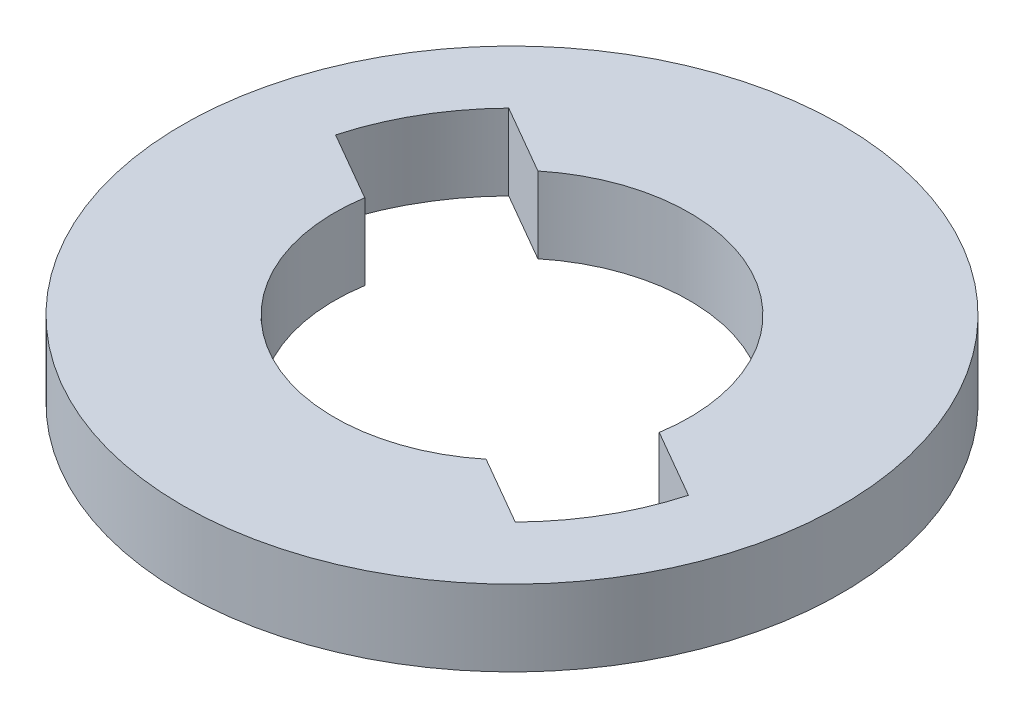
ISO-10303-21;
HEADER;
FILE_DESCRIPTION(('STEP AP214'),'2;1');
FILE_NAME('part.step','',(''),(''),'','','');
FILE_SCHEMA(('AUTOMOTIVE_DESIGN { 1 0 10303 214 1 1 1 1 }'));
ENDSEC;
DATA;
#1=APPLICATION_CONTEXT('core data for automotive mechanical design processes');
#2=APPLICATION_PROTOCOL_DEFINITION('international standard','automotive_design',2000,#1);
#3=PRODUCT_CONTEXT('',#1,'mechanical');
#4=PRODUCT('Part','Part','',(#3));
#5=PRODUCT_RELATED_PRODUCT_CATEGORY('part','',(#4));
#6=PRODUCT_DEFINITION_FORMATION('','',#4);
#7=PRODUCT_DEFINITION_CONTEXT('part definition',#1,'design');
#8=PRODUCT_DEFINITION('design','',#6,#7);
#9=PRODUCT_DEFINITION_SHAPE('','',#8);
#10=(LENGTH_UNIT() NAMED_UNIT(*) SI_UNIT(.MILLI.,.METRE.));
#11=(NAMED_UNIT(*) PLANE_ANGLE_UNIT() SI_UNIT($,.RADIAN.));
#12=(NAMED_UNIT(*) SI_UNIT($,.STERADIAN.) SOLID_ANGLE_UNIT());
#13=UNCERTAINTY_MEASURE_WITH_UNIT(LENGTH_MEASURE(1.E-05),#10,'distance_accuracy_value','');
#14=(GEOMETRIC_REPRESENTATION_CONTEXT(3) GLOBAL_UNCERTAINTY_ASSIGNED_CONTEXT((#13)) GLOBAL_UNIT_ASSIGNED_CONTEXT((#10,
#11,#12)) REPRESENTATION_CONTEXT('',''));
#15=CARTESIAN_POINT('',(0.,0.,0.));
#16=DIRECTION('',(0.,0.,1.));
#17=DIRECTION('',(1.,0.,0.));
#18=AXIS2_PLACEMENT_3D('',#15,#16,#17);
#19=CARTESIAN_POINT('',(-13.01,-9.,-50.0940107675848));
#20=DIRECTION('',(0.,-1.,0.));
#21=DIRECTION('',(0.,0.,-1.));
#22=AXIS2_PLACEMENT_3D('',#19,#20,#21);
#23=PLANE('',#22);
#24=CARTESIAN_POINT('',(0.,-9.,-63.0940107675848));
#25=DIRECTION('',(0.,-1.,0.));
#26=DIRECTION('',(0.,0.,-1.));
#27=AXIS2_PLACEMENT_3D('',#24,#25,#26);
#28=CIRCLE('',#27,13.);
#29=CARTESIAN_POINT('',(0.,-9.,-76.0940107675848));
#30=VERTEX_POINT('',#29);
#31=EDGE_CURVE('E47',#30,#30,#28,.F.);
#32=ORIENTED_EDGE('',*,*,#31,.T.);
#33=EDGE_LOOP('',(#32));
#34=FACE_BOUND('',#33,.T.);
#35=CARTESIAN_POINT('',(0.,-9.,-63.0940107675848));
#36=DIRECTION('',(0.,-1.,0.));
#37=DIRECTION('',(0.,0.,-1.));
#38=AXIS2_PLACEMENT_3D('',#35,#36,#37);
#39=CIRCLE('',#38,10.);
#40=CARTESIAN_POINT('',(-9.63525491562415,-9.,-65.770176440883));
#41=VERTEX_POINT('',#40);
#42=CARTESIAN_POINT('',(-7.13525491562421,-9.,-70.1003034598052));
#43=VERTEX_POINT('',#42);
#44=EDGE_CURVE('E108',#41,#43,#39,.T.);
#45=ORIENTED_EDGE('',*,*,#44,.T.);
#46=DIRECTION('',(-0.866025403784449,0.,-0.499999999999982));
#47=VECTOR('',#46,1.);
#48=CARTESIAN_POINT('',(1.25000000000002,-9.,-65.2590742770462));
#49=LINE('',#48,#47);
#50=CARTESIAN_POINT('',(-4.41237582645304,-9.,-68.5282484847015));
#51=VERTEX_POINT('',#50);
#52=EDGE_CURVE('E128',#51,#43,#49,.T.);
#53=ORIENTED_EDGE('',*,*,#52,.F.);
#54=CARTESIAN_POINT('',(0.,-9.,-63.0940107675848));
#55=DIRECTION('',(0.,-1.,0.));
#56=DIRECTION('',(0.,0.,-1.));
#57=AXIS2_PLACEMENT_3D('',#54,#55,#56);
#58=CIRCLE('',#57,7.);
#59=CARTESIAN_POINT('',(6.91237582645303,-9.,-61.9899000693905));
#60=VERTEX_POINT('',#59);
#61=EDGE_CURVE('E127',#51,#60,#58,.T.);
#62=ORIENTED_EDGE('',*,*,#61,.T.);
#63=DIRECTION('',(0.866025403784443,0.,0.499999999999993));
#64=VECTOR('',#63,1.);
#65=CARTESIAN_POINT('',(1.24999999999994,-9.,-65.2590742770459));
#66=LINE('',#65,#64);
#67=CARTESIAN_POINT('',(9.63525491562419,-9.,-60.4178450942867));
#68=VERTEX_POINT('',#67);
#69=EDGE_CURVE('E153',#60,#68,#66,.T.);
#70=ORIENTED_EDGE('',*,*,#69,.T.);
#71=CARTESIAN_POINT('',(7.13525491562422,-9.,-56.0877180753645));
#72=VERTEX_POINT('',#71);
#73=EDGE_CURVE('E119',#68,#72,#39,.T.);
#74=ORIENTED_EDGE('',*,*,#73,.T.);
#75=DIRECTION('',(0.866025403784443,0.,0.499999999999992));
#76=VECTOR('',#75,1.);
#77=CARTESIAN_POINT('',(-1.25000000000003,-9.,-60.9289472581237));
#78=LINE('',#77,#76);
#79=CARTESIAN_POINT('',(4.41237582645306,-9.,-57.6597730504683));
#80=VERTEX_POINT('',#79);
#81=EDGE_CURVE('E135',#80,#72,#78,.T.);
#82=ORIENTED_EDGE('',*,*,#81,.F.);
#83=CARTESIAN_POINT('',(-6.91237582645309,-9.,-64.1981214657793));
#84=VERTEX_POINT('',#83);
#85=EDGE_CURVE('E124',#80,#84,#58,.T.);
#86=ORIENTED_EDGE('',*,*,#85,.T.);
#87=DIRECTION('',(-0.866025403784447,0.,-0.499999999999986));
#88=VECTOR('',#87,1.);
#89=CARTESIAN_POINT('',(-1.24999999999991,-9.,-60.9289472581239));
#90=LINE('',#89,#88);
#91=EDGE_CURVE('E121',#84,#41,#90,.T.);
#92=ORIENTED_EDGE('',*,*,#91,.T.);
#93=EDGE_LOOP('',(#45,#53,#62,#70,#74,#82,#86,#92));
#94=FACE_BOUND('',#93,.T.);
#95=ADVANCED_FACE('F43',(#34,#94),#23,.F.);
#96=CARTESIAN_POINT('',(0.,-12.,-63.0940107675848));
#97=DIRECTION('',(0.,1.,0.));
#98=DIRECTION('',(0.,0.,1.));
#99=AXIS2_PLACEMENT_3D('',#96,#97,#98);
#100=CYLINDRICAL_SURFACE('',#99,7.);
#101=ORIENTED_EDGE('',*,*,#61,.F.);
#102=DIRECTION('',(0.,1.,0.));
#103=VECTOR('',#102,1.);
#104=CARTESIAN_POINT('',(-4.41237582645303,-12.,-68.5282484847015));
#105=LINE('',#104,#103);
#106=CARTESIAN_POINT('',(-4.41237582645303,-12.,-68.5282484847015));
#107=VERTEX_POINT('',#106);
#108=EDGE_CURVE('E52',#51,#107,#105,.F.);
#109=ORIENTED_EDGE('',*,*,#108,.T.);
#110=CARTESIAN_POINT('',(0.,-12.,-63.0940107675848));
#111=DIRECTION('',(0.,-1.,0.));
#112=DIRECTION('',(0.,0.,-1.));
#113=AXIS2_PLACEMENT_3D('',#110,#111,#112);
#114=CIRCLE('',#113,7.);
#115=CARTESIAN_POINT('',(6.91237582645303,-12.,-61.9899000693905));
#116=VERTEX_POINT('',#115);
#117=EDGE_CURVE('E157',#107,#116,#114,.T.);
#118=ORIENTED_EDGE('',*,*,#117,.T.);
#119=DIRECTION('',(0.,1.,0.));
#120=VECTOR('',#119,1.);
#121=CARTESIAN_POINT('',(6.91237582645303,-12.,-61.9899000693905));
#122=LINE('',#121,#120);
#123=EDGE_CURVE('E168',#60,#116,#122,.F.);
#124=ORIENTED_EDGE('',*,*,#123,.F.);
#125=EDGE_LOOP('',(#101,#109,#118,#124));
#126=FACE_BOUND('',#125,.T.);
#127=ADVANCED_FACE('F173',(#126),#100,.F.);
#128=CARTESIAN_POINT('',(28.5705080756884,1.88125740416496,-49.4855715851502));
#129=DIRECTION('',(0.499999999999993,0.,-0.866025403784443));
#130=DIRECTION('',(-0.866025403784443,0.,-0.499999999999993));
#131=AXIS2_PLACEMENT_3D('',#128,#129,#130);
#132=PLANE('',#131);
#133=ORIENTED_EDGE('',*,*,#123,.T.);
#134=DIRECTION('',(0.866025403784443,0.,0.499999999999993));
#135=VECTOR('',#134,1.);
#136=CARTESIAN_POINT('',(28.5705080756884,-12.,-49.4855715851502));
#137=LINE('',#136,#135);
#138=CARTESIAN_POINT('',(9.63525491562419,-12.,-60.4178450942867));
#139=VERTEX_POINT('',#138);
#140=EDGE_CURVE('E140',#116,#139,#137,.T.);
#141=ORIENTED_EDGE('',*,*,#140,.T.);
#142=DIRECTION('',(0.,-1.,0.));
#143=VECTOR('',#142,1.);
#144=CARTESIAN_POINT('',(9.63525491562419,1.88125740416496,-60.4178450942867));
#145=LINE('',#144,#143);
#146=EDGE_CURVE('E147',#68,#139,#145,.T.);
#147=ORIENTED_EDGE('',*,*,#146,.F.);
#148=ORIENTED_EDGE('',*,*,#69,.F.);
#149=EDGE_LOOP('',(#133,#141,#147,#148));
#150=FACE_BOUND('',#149,.T.);
#151=ADVANCED_FACE('F182',(#150),#132,.F.);
#152=CARTESIAN_POINT('',(28.5705080756881,1.88125740416496,-49.485571585151));
#153=DIRECTION('',(-0.499999999999982,0.,0.866025403784449));
#154=DIRECTION('',(0.866025403784449,0.,0.499999999999982));
#155=AXIS2_PLACEMENT_3D('',#152,#153,#154);
#156=PLANE('',#155);
#157=ORIENTED_EDGE('',*,*,#52,.T.);
#158=DIRECTION('',(0.,-1.,0.));
#159=VECTOR('',#158,1.);
#160=CARTESIAN_POINT('',(-7.13525491562421,1.88125740416496,-70.1003034598052));
#161=LINE('',#160,#159);
#162=CARTESIAN_POINT('',(-7.13525491562421,-12.,-70.1003034598052));
#163=VERTEX_POINT('',#162);
#164=EDGE_CURVE('E115',#43,#163,#161,.T.);
#165=ORIENTED_EDGE('',*,*,#164,.T.);
#166=DIRECTION('',(-0.866025403784449,0.,-0.499999999999982));
#167=VECTOR('',#166,1.);
#168=CARTESIAN_POINT('',(28.5705080756881,-12.,-49.485571585151));
#169=LINE('',#168,#167);
#170=EDGE_CURVE('E60',#107,#163,#169,.T.);
#171=ORIENTED_EDGE('',*,*,#170,.F.);
#172=ORIENTED_EDGE('',*,*,#108,.F.);
#173=EDGE_LOOP('',(#157,#165,#171,#172));
#174=FACE_BOUND('',#173,.T.);
#175=ADVANCED_FACE('F183',(#174),#156,.T.);
#176=CARTESIAN_POINT('',(0.,-9.,-63.0940107675848));
#177=DIRECTION('',(0.,1.,0.));
#178=DIRECTION('',(0.,0.,1.));
#179=AXIS2_PLACEMENT_3D('',#176,#177,#178);
#180=CYLINDRICAL_SURFACE('',#179,10.);
#181=ORIENTED_EDGE('',*,*,#73,.F.);
#182=ORIENTED_EDGE('',*,*,#146,.T.);
#183=CARTESIAN_POINT('',(0.,-12.,-63.0940107675848));
#184=DIRECTION('',(0.,-1.,0.));
#185=DIRECTION('',(0.,0.,-1.));
#186=AXIS2_PLACEMENT_3D('',#183,#184,#185);
#187=CIRCLE('',#186,10.);
#188=CARTESIAN_POINT('',(7.13525491562422,-12.,-56.0877180753645));
#189=VERTEX_POINT('',#188);
#190=EDGE_CURVE('E143',#139,#189,#187,.T.);
#191=ORIENTED_EDGE('',*,*,#190,.T.);
#192=DIRECTION('',(0.,-1.,0.));
#193=VECTOR('',#192,1.);
#194=CARTESIAN_POINT('',(7.13525491562422,1.88125740416496,-56.0877180753645));
#195=LINE('',#194,#193);
#196=EDGE_CURVE('E148',#72,#189,#195,.T.);
#197=ORIENTED_EDGE('',*,*,#196,.F.);
#198=EDGE_LOOP('',(#181,#182,#191,#197));
#199=FACE_BOUND('',#198,.T.);
#200=ADVANCED_FACE('F193',(#199),#180,.F.);
#201=CARTESIAN_POINT('',(26.0705080756884,1.88125740416496,-45.155444566228));
#202=DIRECTION('',(0.499999999999992,0.,-0.866025403784443));
#203=DIRECTION('',(-0.866025403784443,0.,-0.499999999999992));
#204=AXIS2_PLACEMENT_3D('',#201,#202,#203);
#205=PLANE('',#204);
#206=ORIENTED_EDGE('',*,*,#81,.T.);
#207=ORIENTED_EDGE('',*,*,#196,.T.);
#208=DIRECTION('',(0.866025403784443,0.,0.499999999999993));
#209=VECTOR('',#208,1.);
#210=CARTESIAN_POINT('',(26.0705080756884,-12.,-45.155444566228));
#211=LINE('',#210,#209);
#212=CARTESIAN_POINT('',(4.41237582645306,-12.,-57.6597730504683));
#213=VERTEX_POINT('',#212);
#214=EDGE_CURVE('E68',#213,#189,#211,.T.);
#215=ORIENTED_EDGE('',*,*,#214,.F.);
#216=DIRECTION('',(0.,1.,0.));
#217=VECTOR('',#216,1.);
#218=CARTESIAN_POINT('',(4.41237582645306,-12.,-57.6597730504683));
#219=LINE('',#218,#217);
#220=EDGE_CURVE('E166',#80,#213,#219,.F.);
#221=ORIENTED_EDGE('',*,*,#220,.F.);
#222=EDGE_LOOP('',(#206,#207,#215,#221));
#223=FACE_BOUND('',#222,.T.);
#224=ADVANCED_FACE('F190',(#223),#205,.T.);
#225=ORIENTED_EDGE('',*,*,#44,.F.);
#226=DIRECTION('',(0.,-1.,0.));
#227=VECTOR('',#226,1.);
#228=CARTESIAN_POINT('',(-9.63525491562415,1.88125740416496,-65.770176440883));
#229=LINE('',#228,#227);
#230=CARTESIAN_POINT('',(-9.63525491562415,-12.,-65.770176440883));
#231=VERTEX_POINT('',#230);
#232=EDGE_CURVE('E113',#41,#231,#229,.T.);
#233=ORIENTED_EDGE('',*,*,#232,.T.);
#234=CARTESIAN_POINT('',(0.,-12.,-63.0940107675848));
#235=DIRECTION('',(0.,-1.,0.));
#236=DIRECTION('',(0.,0.,-1.));
#237=AXIS2_PLACEMENT_3D('',#234,#235,#236);
#238=CIRCLE('',#237,9.99999999999993);
#239=EDGE_CURVE('E137',#231,#163,#238,.T.);
#240=ORIENTED_EDGE('',*,*,#239,.T.);
#241=ORIENTED_EDGE('',*,*,#164,.F.);
#242=EDGE_LOOP('',(#225,#233,#240,#241));
#243=FACE_BOUND('',#242,.T.);
#244=ADVANCED_FACE('F110',(#243),#180,.F.);
#245=CARTESIAN_POINT('',(0.,-12.,-63.0940107675848));
#246=DIRECTION('',(0.,-1.,0.));
#247=DIRECTION('',(0.,0.,-1.));
#248=AXIS2_PLACEMENT_3D('',#245,#246,#247);
#249=PLANE('',#248);
#250=DIRECTION('',(-0.866025403784447,0.,-0.499999999999986));
#251=VECTOR('',#250,1.);
#252=CARTESIAN_POINT('',(26.0705080756883,-12.,-45.1554445662285));
#253=LINE('',#252,#251);
#254=CARTESIAN_POINT('',(-6.91237582645309,-12.,-64.1981214657793));
#255=VERTEX_POINT('',#254);
#256=EDGE_CURVE('E132',#255,#231,#253,.T.);
#257=ORIENTED_EDGE('',*,*,#256,.F.);
#258=EDGE_CURVE('E160',#213,#255,#114,.T.);
#259=ORIENTED_EDGE('',*,*,#258,.F.);
#260=ORIENTED_EDGE('',*,*,#214,.T.);
#261=ORIENTED_EDGE('',*,*,#190,.F.);
#262=ORIENTED_EDGE('',*,*,#140,.F.);
#263=ORIENTED_EDGE('',*,*,#117,.F.);
#264=ORIENTED_EDGE('',*,*,#170,.T.);
#265=ORIENTED_EDGE('',*,*,#239,.F.);
#266=EDGE_LOOP('',(#257,#259,#260,#261,#262,#263,#264,#265));
#267=FACE_BOUND('',#266,.T.);
#268=CARTESIAN_POINT('',(0.,-12.,-63.0940107675848));
#269=DIRECTION('',(0.,-1.,0.));
#270=DIRECTION('',(0.,0.,-1.));
#271=AXIS2_PLACEMENT_3D('',#268,#269,#270);
#272=CIRCLE('',#271,13.);
#273=CARTESIAN_POINT('',(0.,-12.,-76.0940107675848));
#274=VERTEX_POINT('',#273);
#275=EDGE_CURVE('E163',#274,#274,#272,.T.);
#276=ORIENTED_EDGE('',*,*,#275,.T.);
#277=EDGE_LOOP('',(#276));
#278=FACE_BOUND('',#277,.T.);
#279=ADVANCED_FACE('F177',(#267,#278),#249,.T.);
#280=DIRECTION('',(0.,1.,0.));
#281=VECTOR('',#280,1.);
#282=CARTESIAN_POINT('',(-6.91237582645309,-12.,-64.1981214657793));
#283=LINE('',#282,#281);
#284=EDGE_CURVE('E11',#84,#255,#283,.F.);
#285=ORIENTED_EDGE('',*,*,#284,.F.);
#286=ORIENTED_EDGE('',*,*,#85,.F.);
#287=ORIENTED_EDGE('',*,*,#220,.T.);
#288=ORIENTED_EDGE('',*,*,#258,.T.);
#289=EDGE_LOOP('',(#285,#286,#287,#288));
#290=FACE_BOUND('',#289,.T.);
#291=ADVANCED_FACE('F189',(#290),#100,.F.);
#292=CARTESIAN_POINT('',(26.0705080756883,1.88125740416496,-45.1554445662285));
#293=DIRECTION('',(-0.499999999999986,0.,0.866025403784447));
#294=DIRECTION('',(0.866025403784447,0.,0.499999999999986));
#295=AXIS2_PLACEMENT_3D('',#292,#293,#294);
#296=PLANE('',#295);
#297=ORIENTED_EDGE('',*,*,#284,.T.);
#298=ORIENTED_EDGE('',*,*,#256,.T.);
#299=ORIENTED_EDGE('',*,*,#232,.F.);
#300=ORIENTED_EDGE('',*,*,#91,.F.);
#301=EDGE_LOOP('',(#297,#298,#299,#300));
#302=FACE_BOUND('',#301,.T.);
#303=ADVANCED_FACE('F130',(#302),#296,.F.);
#304=CARTESIAN_POINT('',(0.,-12.01,-63.0940107675848));
#305=DIRECTION('',(0.,1.,0.));
#306=DIRECTION('',(0.,0.,1.));
#307=AXIS2_PLACEMENT_3D('',#304,#305,#306);
#308=CYLINDRICAL_SURFACE('',#307,13.);
#309=ORIENTED_EDGE('',*,*,#31,.F.);
#310=EDGE_LOOP('',(#309));
#311=FACE_BOUND('',#310,.T.);
#312=ORIENTED_EDGE('',*,*,#275,.F.);
#313=EDGE_LOOP('',(#312));
#314=FACE_BOUND('',#313,.T.);
#315=ADVANCED_FACE('F45',(#311,#314),#308,.T.);
#316=CLOSED_SHELL('',(#95,#127,#151,#175,#200,#224,#244,#279,#291,#303,#315));
#317=MANIFOLD_SOLID_BREP('B2',#316);
#318=ADVANCED_BREP_SHAPE_REPRESENTATION('',(#18,#317),#14);
#319=SHAPE_DEFINITION_REPRESENTATION(#9,#318);
ENDSEC;
END-ISO-10303-21;
